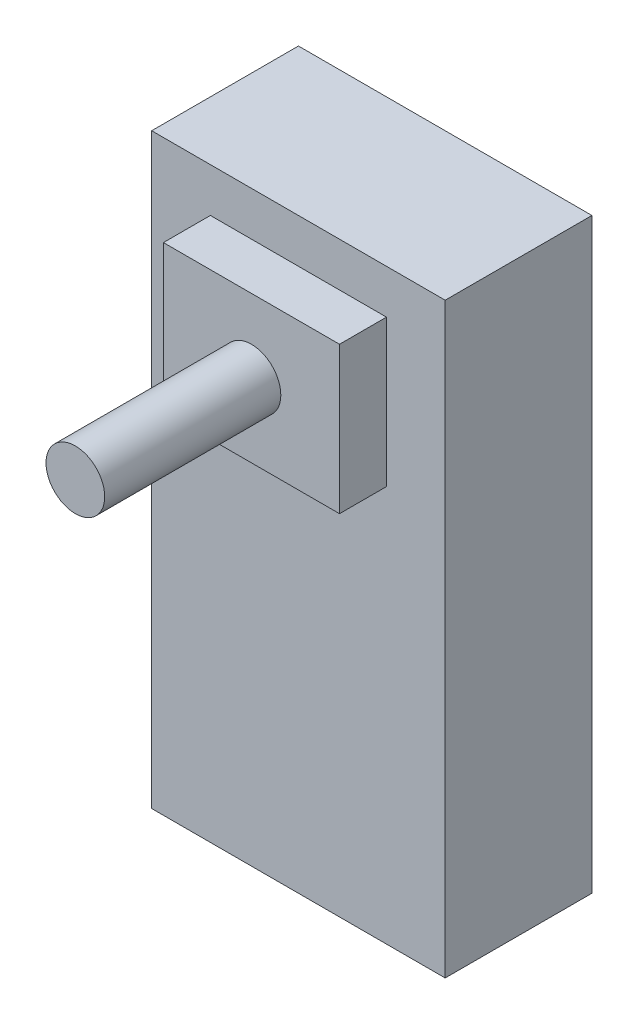
ISO-10303-21;
HEADER;
FILE_DESCRIPTION(('STEP AP214'),'2;1');
FILE_NAME('part.step','',(''),(''),'','','');
FILE_SCHEMA(('AUTOMOTIVE_DESIGN { 1 0 10303 214 1 1 1 1 }'));
ENDSEC;
DATA;
#1=APPLICATION_CONTEXT('core data for automotive mechanical design processes');
#2=APPLICATION_PROTOCOL_DEFINITION('international standard','automotive_design',2000,#1);
#3=PRODUCT_CONTEXT('',#1,'mechanical');
#4=PRODUCT('Part','Part','',(#3));
#5=PRODUCT_RELATED_PRODUCT_CATEGORY('part','',(#4));
#6=PRODUCT_DEFINITION_FORMATION('','',#4);
#7=PRODUCT_DEFINITION_CONTEXT('part definition',#1,'design');
#8=PRODUCT_DEFINITION('design','',#6,#7);
#9=PRODUCT_DEFINITION_SHAPE('','',#8);
#10=(LENGTH_UNIT() NAMED_UNIT(*) SI_UNIT(.MILLI.,.METRE.));
#11=(NAMED_UNIT(*) PLANE_ANGLE_UNIT() SI_UNIT($,.RADIAN.));
#12=(NAMED_UNIT(*) SI_UNIT($,.STERADIAN.) SOLID_ANGLE_UNIT());
#13=UNCERTAINTY_MEASURE_WITH_UNIT(LENGTH_MEASURE(1.E-05),#10,'distance_accuracy_value','');
#14=(GEOMETRIC_REPRESENTATION_CONTEXT(3) GLOBAL_UNCERTAINTY_ASSIGNED_CONTEXT((#13)) GLOBAL_UNIT_ASSIGNED_CONTEXT((#10,
#11,#12)) REPRESENTATION_CONTEXT('',''));
#15=CARTESIAN_POINT('',(0.,0.,0.));
#16=DIRECTION('',(0.,0.,1.));
#17=DIRECTION('',(1.,0.,0.));
#18=AXIS2_PLACEMENT_3D('',#15,#16,#17);
#19=CARTESIAN_POINT('',(0.,0.,0.));
#20=DIRECTION('',(0.,0.,-1.));
#21=DIRECTION('',(-1.,0.,0.));
#22=AXIS2_PLACEMENT_3D('',#19,#20,#21);
#23=PLANE('',#22);
#24=DIRECTION('',(0.,1.,0.));
#25=VECTOR('',#24,1.);
#26=CARTESIAN_POINT('',(25.,-50.,0.));
#27=LINE('',#26,#25);
#28=CARTESIAN_POINT('',(25.,-50.,0.));
#29=VERTEX_POINT('',#28);
#30=CARTESIAN_POINT('',(25.,50.,0.));
#31=VERTEX_POINT('',#30);
#32=EDGE_CURVE('E120',#29,#31,#27,.T.);
#33=ORIENTED_EDGE('',*,*,#32,.T.);
#34=DIRECTION('',(-1.,0.,0.));
#35=VECTOR('',#34,1.);
#36=CARTESIAN_POINT('',(-25.,50.,0.));
#37=LINE('',#36,#35);
#38=CARTESIAN_POINT('',(-25.,50.,0.));
#39=VERTEX_POINT('',#38);
#40=EDGE_CURVE('E123',#31,#39,#37,.T.);
#41=ORIENTED_EDGE('',*,*,#40,.T.);
#42=DIRECTION('',(0.,-1.,0.));
#43=VECTOR('',#42,1.);
#44=CARTESIAN_POINT('',(-25.,-50.,0.));
#45=LINE('',#44,#43);
#46=CARTESIAN_POINT('',(-25.,-50.,0.));
#47=VERTEX_POINT('',#46);
#48=EDGE_CURVE('E144',#39,#47,#45,.T.);
#49=ORIENTED_EDGE('',*,*,#48,.T.);
#50=DIRECTION('',(1.,0.,0.));
#51=VECTOR('',#50,1.);
#52=CARTESIAN_POINT('',(-25.,-50.,0.));
#53=LINE('',#52,#51);
#54=EDGE_CURVE('E133',#47,#29,#53,.T.);
#55=ORIENTED_EDGE('',*,*,#54,.T.);
#56=EDGE_LOOP('',(#33,#41,#49,#55));
#57=FACE_BOUND('',#56,.T.);
#58=DIRECTION('',(0.,1.,0.));
#59=VECTOR('',#58,1.);
#60=CARTESIAN_POINT('',(15.,42.5,0.));
#61=LINE('',#60,#59);
#62=CARTESIAN_POINT('',(15.,17.5,0.));
#63=VERTEX_POINT('',#62);
#64=CARTESIAN_POINT('',(15.,42.5,0.));
#65=VERTEX_POINT('',#64);
#66=EDGE_CURVE('E119',#63,#65,#61,.T.);
#67=ORIENTED_EDGE('',*,*,#66,.F.);
#68=DIRECTION('',(1.,0.,0.));
#69=VECTOR('',#68,1.);
#70=CARTESIAN_POINT('',(-15.,17.5,0.));
#71=LINE('',#70,#69);
#72=CARTESIAN_POINT('',(-15.,17.5,0.));
#73=VERTEX_POINT('',#72);
#74=EDGE_CURVE('E116',#73,#63,#71,.T.);
#75=ORIENTED_EDGE('',*,*,#74,.F.);
#76=DIRECTION('',(0.,-1.,0.));
#77=VECTOR('',#76,1.);
#78=CARTESIAN_POINT('',(-15.,42.5,0.));
#79=LINE('',#78,#77);
#80=CARTESIAN_POINT('',(-15.,42.5,0.));
#81=VERTEX_POINT('',#80);
#82=EDGE_CURVE('E55',#81,#73,#79,.T.);
#83=ORIENTED_EDGE('',*,*,#82,.F.);
#84=DIRECTION('',(-1.,0.,0.));
#85=VECTOR('',#84,1.);
#86=CARTESIAN_POINT('',(-15.,42.5,0.));
#87=LINE('',#86,#85);
#88=EDGE_CURVE('E50',#65,#81,#87,.T.);
#89=ORIENTED_EDGE('',*,*,#88,.F.);
#90=EDGE_LOOP('',(#67,#75,#83,#89));
#91=FACE_BOUND('',#90,.T.);
#92=ADVANCED_FACE('F33',(#57,#91),#23,.F.);
#93=CARTESIAN_POINT('',(25.,-50.,-25.));
#94=DIRECTION('',(1.,0.,0.));
#95=DIRECTION('',(0.,0.,-1.));
#96=AXIS2_PLACEMENT_3D('',#93,#94,#95);
#97=PLANE('',#96);
#98=ORIENTED_EDGE('',*,*,#32,.F.);
#99=DIRECTION('',(0.,0.,1.));
#100=VECTOR('',#99,1.);
#101=CARTESIAN_POINT('',(25.,-50.,-25.));
#102=LINE('',#101,#100);
#103=CARTESIAN_POINT('',(25.,-50.,-25.));
#104=VERTEX_POINT('',#103);
#105=EDGE_CURVE('E11',#104,#29,#102,.T.);
#106=ORIENTED_EDGE('',*,*,#105,.F.);
#107=DIRECTION('',(0.,1.,0.));
#108=VECTOR('',#107,1.);
#109=CARTESIAN_POINT('',(25.,-50.,-25.));
#110=LINE('',#109,#108);
#111=CARTESIAN_POINT('',(25.,50.,-25.));
#112=VERTEX_POINT('',#111);
#113=EDGE_CURVE('E129',#104,#112,#110,.T.);
#114=ORIENTED_EDGE('',*,*,#113,.T.);
#115=DIRECTION('',(0.,0.,1.));
#116=VECTOR('',#115,1.);
#117=CARTESIAN_POINT('',(25.,50.,-25.));
#118=LINE('',#117,#116);
#119=EDGE_CURVE('E37',#112,#31,#118,.T.);
#120=ORIENTED_EDGE('',*,*,#119,.T.);
#121=EDGE_LOOP('',(#98,#106,#114,#120));
#122=FACE_BOUND('',#121,.T.);
#123=ADVANCED_FACE('F35',(#122),#97,.T.);
#124=CARTESIAN_POINT('',(-25.,-50.,-25.));
#125=DIRECTION('',(0.,-1.,0.));
#126=DIRECTION('',(0.,0.,-1.));
#127=AXIS2_PLACEMENT_3D('',#124,#125,#126);
#128=PLANE('',#127);
#129=ORIENTED_EDGE('',*,*,#54,.F.);
#130=DIRECTION('',(0.,0.,1.));
#131=VECTOR('',#130,1.);
#132=CARTESIAN_POINT('',(-25.,-50.,-25.));
#133=LINE('',#132,#131);
#134=CARTESIAN_POINT('',(-25.,-50.,-25.));
#135=VERTEX_POINT('',#134);
#136=EDGE_CURVE('E42',#135,#47,#133,.T.);
#137=ORIENTED_EDGE('',*,*,#136,.F.);
#138=DIRECTION('',(1.,0.,0.));
#139=VECTOR('',#138,1.);
#140=CARTESIAN_POINT('',(-25.,-50.,-25.));
#141=LINE('',#140,#139);
#142=EDGE_CURVE('E139',#135,#104,#141,.T.);
#143=ORIENTED_EDGE('',*,*,#142,.T.);
#144=ORIENTED_EDGE('',*,*,#105,.T.);
#145=EDGE_LOOP('',(#129,#137,#143,#144));
#146=FACE_BOUND('',#145,.T.);
#147=ADVANCED_FACE('F161',(#146),#128,.T.);
#148=CARTESIAN_POINT('',(-25.,-50.,-25.));
#149=DIRECTION('',(-1.,0.,0.));
#150=DIRECTION('',(0.,0.,1.));
#151=AXIS2_PLACEMENT_3D('',#148,#149,#150);
#152=PLANE('',#151);
#153=ORIENTED_EDGE('',*,*,#48,.F.);
#154=DIRECTION('',(0.,0.,1.));
#155=VECTOR('',#154,1.);
#156=CARTESIAN_POINT('',(-25.,50.,-25.));
#157=LINE('',#156,#155);
#158=CARTESIAN_POINT('',(-25.,50.,-25.));
#159=VERTEX_POINT('',#158);
#160=EDGE_CURVE('E149',#159,#39,#157,.T.);
#161=ORIENTED_EDGE('',*,*,#160,.F.);
#162=DIRECTION('',(0.,-1.,0.));
#163=VECTOR('',#162,1.);
#164=CARTESIAN_POINT('',(-25.,-50.,-25.));
#165=LINE('',#164,#163);
#166=EDGE_CURVE('E136',#159,#135,#165,.T.);
#167=ORIENTED_EDGE('',*,*,#166,.T.);
#168=ORIENTED_EDGE('',*,*,#136,.T.);
#169=EDGE_LOOP('',(#153,#161,#167,#168));
#170=FACE_BOUND('',#169,.T.);
#171=ADVANCED_FACE('F167',(#170),#152,.T.);
#172=CARTESIAN_POINT('',(-25.,50.,-25.));
#173=DIRECTION('',(0.,1.,0.));
#174=DIRECTION('',(0.,0.,1.));
#175=AXIS2_PLACEMENT_3D('',#172,#173,#174);
#176=PLANE('',#175);
#177=ORIENTED_EDGE('',*,*,#40,.F.);
#178=ORIENTED_EDGE('',*,*,#119,.F.);
#179=DIRECTION('',(-1.,0.,0.));
#180=VECTOR('',#179,1.);
#181=CARTESIAN_POINT('',(-25.,50.,-25.));
#182=LINE('',#181,#180);
#183=EDGE_CURVE('E132',#112,#159,#182,.T.);
#184=ORIENTED_EDGE('',*,*,#183,.T.);
#185=ORIENTED_EDGE('',*,*,#160,.T.);
#186=EDGE_LOOP('',(#177,#178,#184,#185));
#187=FACE_BOUND('',#186,.T.);
#188=ADVANCED_FACE('F157',(#187),#176,.T.);
#189=CARTESIAN_POINT('',(0.,0.,-25.));
#190=DIRECTION('',(0.,0.,-1.));
#191=DIRECTION('',(-1.,0.,0.));
#192=AXIS2_PLACEMENT_3D('',#189,#190,#191);
#193=PLANE('',#192);
#194=ORIENTED_EDGE('',*,*,#113,.F.);
#195=ORIENTED_EDGE('',*,*,#142,.F.);
#196=ORIENTED_EDGE('',*,*,#166,.F.);
#197=ORIENTED_EDGE('',*,*,#183,.F.);
#198=EDGE_LOOP('',(#194,#195,#196,#197));
#199=FACE_BOUND('',#198,.T.);
#200=ADVANCED_FACE('F164',(#199),#193,.T.);
#201=CARTESIAN_POINT('',(15.,42.5,8.));
#202=DIRECTION('',(-1.,0.,0.));
#203=DIRECTION('',(0.,-1.,0.));
#204=AXIS2_PLACEMENT_3D('',#201,#202,#203);
#205=PLANE('',#204);
#206=ORIENTED_EDGE('',*,*,#66,.T.);
#207=DIRECTION('',(0.,0.,-1.));
#208=VECTOR('',#207,1.);
#209=CARTESIAN_POINT('',(15.,42.5,8.));
#210=LINE('',#209,#208);
#211=CARTESIAN_POINT('',(15.,42.5,8.));
#212=VERTEX_POINT('',#211);
#213=EDGE_CURVE('E100',#212,#65,#210,.T.);
#214=ORIENTED_EDGE('',*,*,#213,.F.);
#215=DIRECTION('',(0.,1.,0.));
#216=VECTOR('',#215,1.);
#217=CARTESIAN_POINT('',(15.,42.5,8.));
#218=LINE('',#217,#216);
#219=CARTESIAN_POINT('',(15.,17.5,8.));
#220=VERTEX_POINT('',#219);
#221=EDGE_CURVE('E107',#220,#212,#218,.T.);
#222=ORIENTED_EDGE('',*,*,#221,.F.);
#223=DIRECTION('',(0.,0.,-1.));
#224=VECTOR('',#223,1.);
#225=CARTESIAN_POINT('',(15.,17.5,8.));
#226=LINE('',#225,#224);
#227=EDGE_CURVE('E217',#220,#63,#226,.T.);
#228=ORIENTED_EDGE('',*,*,#227,.T.);
#229=EDGE_LOOP('',(#206,#214,#222,#228));
#230=FACE_BOUND('',#229,.T.);
#231=ADVANCED_FACE('F118',(#230),#205,.F.);
#232=CARTESIAN_POINT('',(-15.,42.5,8.));
#233=DIRECTION('',(0.,-1.,0.));
#234=DIRECTION('',(0.,0.,-1.));
#235=AXIS2_PLACEMENT_3D('',#232,#233,#234);
#236=PLANE('',#235);
#237=ORIENTED_EDGE('',*,*,#88,.T.);
#238=DIRECTION('',(0.,0.,-1.));
#239=VECTOR('',#238,1.);
#240=CARTESIAN_POINT('',(-15.,42.5,8.));
#241=LINE('',#240,#239);
#242=CARTESIAN_POINT('',(-15.,42.5,8.));
#243=VERTEX_POINT('',#242);
#244=EDGE_CURVE('E103',#243,#81,#241,.T.);
#245=ORIENTED_EDGE('',*,*,#244,.F.);
#246=DIRECTION('',(-1.,0.,0.));
#247=VECTOR('',#246,1.);
#248=CARTESIAN_POINT('',(-15.,42.5,8.));
#249=LINE('',#248,#247);
#250=EDGE_CURVE('E96',#212,#243,#249,.T.);
#251=ORIENTED_EDGE('',*,*,#250,.F.);
#252=ORIENTED_EDGE('',*,*,#213,.T.);
#253=EDGE_LOOP('',(#237,#245,#251,#252));
#254=FACE_BOUND('',#253,.T.);
#255=ADVANCED_FACE('F98',(#254),#236,.F.);
#256=CARTESIAN_POINT('',(-15.,42.5,8.));
#257=DIRECTION('',(1.,0.,0.));
#258=DIRECTION('',(0.,1.,0.));
#259=AXIS2_PLACEMENT_3D('',#256,#257,#258);
#260=PLANE('',#259);
#261=ORIENTED_EDGE('',*,*,#82,.T.);
#262=DIRECTION('',(0.,0.,-1.));
#263=VECTOR('',#262,1.);
#264=CARTESIAN_POINT('',(-15.,17.5,8.));
#265=LINE('',#264,#263);
#266=CARTESIAN_POINT('',(-15.,17.5,8.));
#267=VERTEX_POINT('',#266);
#268=EDGE_CURVE('E125',#267,#73,#265,.T.);
#269=ORIENTED_EDGE('',*,*,#268,.F.);
#270=DIRECTION('',(0.,-1.,0.));
#271=VECTOR('',#270,1.);
#272=CARTESIAN_POINT('',(-15.,42.5,8.));
#273=LINE('',#272,#271);
#274=EDGE_CURVE('E106',#243,#267,#273,.T.);
#275=ORIENTED_EDGE('',*,*,#274,.F.);
#276=ORIENTED_EDGE('',*,*,#244,.T.);
#277=EDGE_LOOP('',(#261,#269,#275,#276));
#278=FACE_BOUND('',#277,.T.);
#279=ADVANCED_FACE('F187',(#278),#260,.F.);
#280=CARTESIAN_POINT('',(-15.,17.5,8.));
#281=DIRECTION('',(0.,1.,0.));
#282=DIRECTION('',(0.,0.,1.));
#283=AXIS2_PLACEMENT_3D('',#280,#281,#282);
#284=PLANE('',#283);
#285=ORIENTED_EDGE('',*,*,#74,.T.);
#286=ORIENTED_EDGE('',*,*,#227,.F.);
#287=DIRECTION('',(1.,0.,0.));
#288=VECTOR('',#287,1.);
#289=CARTESIAN_POINT('',(-15.,17.5,8.));
#290=LINE('',#289,#288);
#291=EDGE_CURVE('E112',#267,#220,#290,.T.);
#292=ORIENTED_EDGE('',*,*,#291,.F.);
#293=ORIENTED_EDGE('',*,*,#268,.T.);
#294=EDGE_LOOP('',(#285,#286,#292,#293));
#295=FACE_BOUND('',#294,.T.);
#296=ADVANCED_FACE('F190',(#295),#284,.F.);
#297=CARTESIAN_POINT('',(0.,0.,8.));
#298=DIRECTION('',(0.,0.,1.));
#299=DIRECTION('',(1.,0.,0.));
#300=AXIS2_PLACEMENT_3D('',#297,#298,#299);
#301=PLANE('',#300);
#302=CARTESIAN_POINT('',(0.,30.,8.));
#303=DIRECTION('',(0.,0.,1.));
#304=DIRECTION('',(1.,0.,0.));
#305=AXIS2_PLACEMENT_3D('',#302,#303,#304);
#306=CIRCLE('',#305,5.);
#307=CARTESIAN_POINT('',(5.,30.,8.));
#308=VERTEX_POINT('',#307);
#309=EDGE_CURVE('E210',#308,#308,#306,.T.);
#310=ORIENTED_EDGE('',*,*,#309,.F.);
#311=EDGE_LOOP('',(#310));
#312=FACE_BOUND('',#311,.T.);
#313=ORIENTED_EDGE('',*,*,#221,.T.);
#314=ORIENTED_EDGE('',*,*,#250,.T.);
#315=ORIENTED_EDGE('',*,*,#274,.T.);
#316=ORIENTED_EDGE('',*,*,#291,.T.);
#317=EDGE_LOOP('',(#313,#314,#315,#316));
#318=FACE_BOUND('',#317,.T.);
#319=ADVANCED_FACE('F110',(#312,#318),#301,.T.);
#320=CARTESIAN_POINT('',(0.,30.,38.));
#321=DIRECTION('',(0.,0.,-1.));
#322=DIRECTION('',(-1.,0.,0.));
#323=AXIS2_PLACEMENT_3D('',#320,#321,#322);
#324=CYLINDRICAL_SURFACE('',#323,5.);
#325=CARTESIAN_POINT('',(0.,30.,38.));
#326=DIRECTION('',(0.,0.,1.));
#327=DIRECTION('',(1.,0.,0.));
#328=AXIS2_PLACEMENT_3D('',#325,#326,#327);
#329=CIRCLE('',#328,5.);
#330=CARTESIAN_POINT('',(5.,30.,38.));
#331=VERTEX_POINT('',#330);
#332=EDGE_CURVE('E209',#331,#331,#329,.T.);
#333=ORIENTED_EDGE('',*,*,#332,.F.);
#334=EDGE_LOOP('',(#333));
#335=FACE_BOUND('',#334,.T.);
#336=ORIENTED_EDGE('',*,*,#309,.T.);
#337=EDGE_LOOP('',(#336));
#338=FACE_BOUND('',#337,.T.);
#339=ADVANCED_FACE('F197',(#335,#338),#324,.T.);
#340=CARTESIAN_POINT('',(0.,30.,38.));
#341=DIRECTION('',(0.,0.,1.));
#342=DIRECTION('',(1.,0.,0.));
#343=AXIS2_PLACEMENT_3D('',#340,#341,#342);
#344=PLANE('',#343);
#345=ORIENTED_EDGE('',*,*,#332,.T.);
#346=EDGE_LOOP('',(#345));
#347=FACE_BOUND('',#346,.T.);
#348=ADVANCED_FACE('F201',(#347),#344,.T.);
#349=CLOSED_SHELL('',(#92,#123,#147,#171,#188,#200,#231,#255,#279,#296,#319,#339,#348));
#350=MANIFOLD_SOLID_BREP('B2',#349);
#351=ADVANCED_BREP_SHAPE_REPRESENTATION('',(#18,#350),#14);
#352=SHAPE_DEFINITION_REPRESENTATION(#9,#351);
ENDSEC;
END-ISO-10303-21;
